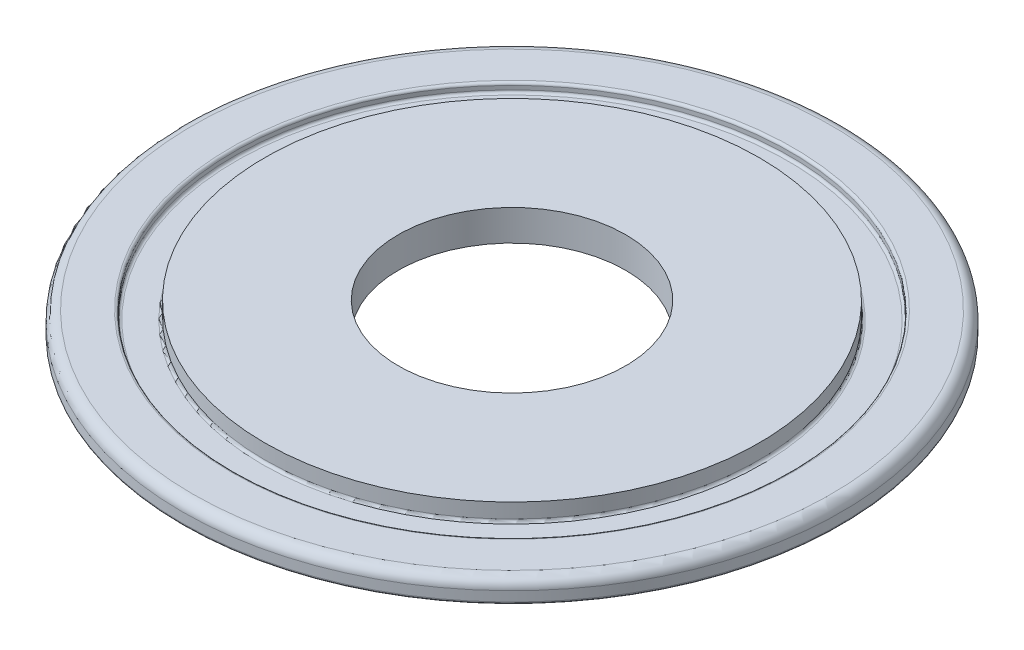
ISO-10303-21;
HEADER;
FILE_DESCRIPTION(('STEP AP214'),'2;1');
FILE_NAME('part.step','',(''),(''),'','','');
FILE_SCHEMA(('AUTOMOTIVE_DESIGN { 1 0 10303 214 1 1 1 1 }'));
ENDSEC;
DATA;
#1=APPLICATION_CONTEXT('core data for automotive mechanical design processes');
#2=APPLICATION_PROTOCOL_DEFINITION('international standard','automotive_design',2000,#1);
#3=PRODUCT_CONTEXT('',#1,'mechanical');
#4=PRODUCT('Part','Part','',(#3));
#5=PRODUCT_RELATED_PRODUCT_CATEGORY('part','',(#4));
#6=PRODUCT_DEFINITION_FORMATION('','',#4);
#7=PRODUCT_DEFINITION_CONTEXT('part definition',#1,'design');
#8=PRODUCT_DEFINITION('design','',#6,#7);
#9=PRODUCT_DEFINITION_SHAPE('','',#8);
#10=(LENGTH_UNIT() NAMED_UNIT(*) SI_UNIT(.MILLI.,.METRE.));
#11=(NAMED_UNIT(*) PLANE_ANGLE_UNIT() SI_UNIT($,.RADIAN.));
#12=(NAMED_UNIT(*) SI_UNIT($,.STERADIAN.) SOLID_ANGLE_UNIT());
#13=UNCERTAINTY_MEASURE_WITH_UNIT(LENGTH_MEASURE(1.E-05),#10,'distance_accuracy_value','');
#14=(GEOMETRIC_REPRESENTATION_CONTEXT(3) GLOBAL_UNCERTAINTY_ASSIGNED_CONTEXT((#13)) GLOBAL_UNIT_ASSIGNED_CONTEXT((#10,
#11,#12)) REPRESENTATION_CONTEXT('',''));
#15=CARTESIAN_POINT('',(0.,0.,0.));
#16=DIRECTION('',(0.,0.,1.));
#17=DIRECTION('',(1.,0.,0.));
#18=AXIS2_PLACEMENT_3D('',#15,#16,#17);
#19=CARTESIAN_POINT('',(50.8,0.,0.));
#20=DIRECTION('',(0.,-1.,0.));
#21=DIRECTION('',(0.,0.,-1.));
#22=AXIS2_PLACEMENT_3D('',#19,#20,#21);
#23=PLANE('',#22);
#24=CARTESIAN_POINT('',(0.,0.,0.));
#25=DIRECTION('',(0.,-1.,0.));
#26=DIRECTION('',(0.,0.,-1.));
#27=AXIS2_PLACEMENT_3D('',#24,#25,#26);
#28=CIRCLE('',#27,50.403125);
#29=CARTESIAN_POINT('',(0.,0.,-50.403125));
#30=VERTEX_POINT('',#29);
#31=EDGE_CURVE('E68',#30,#30,#28,.T.);
#32=ORIENTED_EDGE('',*,*,#31,.T.);
#33=EDGE_LOOP('',(#32));
#34=FACE_BOUND('',#33,.T.);
#35=CARTESIAN_POINT('',(0.,0.,0.));
#36=DIRECTION('',(0.,-1.,0.));
#37=DIRECTION('',(0.,0.,-1.));
#38=AXIS2_PLACEMENT_3D('',#35,#36,#37);
#39=CIRCLE('',#38,17.526);
#40=CARTESIAN_POINT('',(0.,0.,-17.526));
#41=VERTEX_POINT('',#40);
#42=EDGE_CURVE('E71',#41,#41,#39,.T.);
#43=ORIENTED_EDGE('',*,*,#42,.F.);
#44=EDGE_LOOP('',(#43));
#45=FACE_BOUND('',#44,.T.);
#46=ADVANCED_FACE('F33',(#34,#45),#23,.T.);
#47=CARTESIAN_POINT('',(0.,0.,0.));
#48=DIRECTION('',(0.,-1.,0.));
#49=DIRECTION('',(0.,0.,-1.));
#50=AXIS2_PLACEMENT_3D('',#47,#48,#49);
#51=CYLINDRICAL_SURFACE('',#50,17.526);
#52=ORIENTED_EDGE('',*,*,#42,.T.);
#53=EDGE_LOOP('',(#52));
#54=FACE_BOUND('',#53,.T.);
#55=CARTESIAN_POINT('',(0.,4.7625,0.));
#56=DIRECTION('',(0.,-1.,0.));
#57=DIRECTION('',(0.,0.,-1.));
#58=AXIS2_PLACEMENT_3D('',#55,#56,#57);
#59=CIRCLE('',#58,17.526);
#60=CARTESIAN_POINT('',(0.,4.7625,-17.526));
#61=VERTEX_POINT('',#60);
#62=EDGE_CURVE('E74',#61,#61,#59,.T.);
#63=ORIENTED_EDGE('',*,*,#62,.F.);
#64=EDGE_LOOP('',(#63));
#65=FACE_BOUND('',#64,.T.);
#66=ADVANCED_FACE('F85',(#54,#65),#51,.F.);
#67=CARTESIAN_POINT('',(38.1,4.7625,0.));
#68=DIRECTION('',(0.,1.,0.));
#69=DIRECTION('',(0.,0.,1.));
#70=AXIS2_PLACEMENT_3D('',#67,#68,#69);
#71=PLANE('',#70);
#72=ORIENTED_EDGE('',*,*,#62,.T.);
#73=EDGE_LOOP('',(#72));
#74=FACE_BOUND('',#73,.T.);
#75=CARTESIAN_POINT('',(0.,4.7625,0.));
#76=DIRECTION('',(0.,-1.,0.));
#77=DIRECTION('',(0.,0.,-1.));
#78=AXIS2_PLACEMENT_3D('',#75,#76,#77);
#79=CIRCLE('',#78,38.1);
#80=CARTESIAN_POINT('',(0.,4.7625,-38.1));
#81=VERTEX_POINT('',#80);
#82=EDGE_CURVE('E77',#81,#81,#79,.T.);
#83=ORIENTED_EDGE('',*,*,#82,.F.);
#84=EDGE_LOOP('',(#83));
#85=FACE_BOUND('',#84,.T.);
#86=ADVANCED_FACE('F83',(#74,#85),#71,.T.);
#87=CARTESIAN_POINT('',(0.,0.,0.));
#88=DIRECTION('',(0.,-1.,0.));
#89=DIRECTION('',(0.,0.,-1.));
#90=AXIS2_PLACEMENT_3D('',#87,#88,#89);
#91=CYLINDRICAL_SURFACE('',#90,38.1);
#92=CARTESIAN_POINT('',(0.,2.492375,0.));
#93=DIRECTION('',(0.,1.,0.));
#94=DIRECTION('',(0.,0.,1.));
#95=AXIS2_PLACEMENT_3D('',#92,#93,#94);
#96=CIRCLE('',#95,38.1);
#97=CARTESIAN_POINT('',(0.,2.492375,38.1));
#98=VERTEX_POINT('',#97);
#99=EDGE_CURVE('E44',#98,#98,#96,.T.);
#100=ORIENTED_EDGE('',*,*,#99,.T.);
#101=EDGE_LOOP('',(#100));
#102=FACE_BOUND('',#101,.T.);
#103=ORIENTED_EDGE('',*,*,#82,.T.);
#104=EDGE_LOOP('',(#103));
#105=FACE_BOUND('',#104,.T.);
#106=ADVANCED_FACE('F81',(#102,#105),#91,.T.);
#107=CARTESIAN_POINT('',(42.926,2.0955,0.));
#108=DIRECTION('',(0.,1.,0.));
#109=DIRECTION('',(0.,0.,1.));
#110=AXIS2_PLACEMENT_3D('',#107,#108,#109);
#111=PLANE('',#110);
#112=CARTESIAN_POINT('',(0.,2.0955,0.));
#113=DIRECTION('',(0.,1.,0.));
#114=DIRECTION('',(0.,0.,1.));
#115=AXIS2_PLACEMENT_3D('',#112,#113,#114);
#116=CIRCLE('',#115,38.496875);
#117=CARTESIAN_POINT('',(0.,2.0955,38.496875));
#118=VERTEX_POINT('',#117);
#119=EDGE_CURVE('E48',#118,#118,#116,.F.);
#120=ORIENTED_EDGE('',*,*,#119,.T.);
#121=EDGE_LOOP('',(#120));
#122=FACE_BOUND('',#121,.T.);
#123=CARTESIAN_POINT('',(0.,2.0955,0.));
#124=DIRECTION('',(0.,1.,0.));
#125=DIRECTION('',(0.,0.,1.));
#126=AXIS2_PLACEMENT_3D('',#123,#124,#125);
#127=CIRCLE('',#126,42.529125);
#128=CARTESIAN_POINT('',(0.,2.0955,42.529125));
#129=VERTEX_POINT('',#128);
#130=EDGE_CURVE('E53',#129,#129,#127,.T.);
#131=ORIENTED_EDGE('',*,*,#130,.T.);
#132=EDGE_LOOP('',(#131));
#133=FACE_BOUND('',#132,.T.);
#134=ADVANCED_FACE('F92',(#122,#133),#111,.T.);
#135=CARTESIAN_POINT('',(0.,0.,0.));
#136=DIRECTION('',(0.,-1.,0.));
#137=DIRECTION('',(0.,0.,-1.));
#138=AXIS2_PLACEMENT_3D('',#135,#136,#137);
#139=CYLINDRICAL_SURFACE('',#138,42.926);
#140=CARTESIAN_POINT('',(0.,3.095625,0.));
#141=DIRECTION('',(0.,1.,0.));
#142=DIRECTION('',(0.,0.,1.));
#143=AXIS2_PLACEMENT_3D('',#140,#141,#142);
#144=CIRCLE('',#143,42.926);
#145=CARTESIAN_POINT('',(0.,3.095625,42.926));
#146=VERTEX_POINT('',#145);
#147=EDGE_CURVE('E56',#146,#146,#144,.T.);
#148=ORIENTED_EDGE('',*,*,#147,.T.);
#149=EDGE_LOOP('',(#148));
#150=FACE_BOUND('',#149,.T.);
#151=CARTESIAN_POINT('',(0.,2.492375,0.));
#152=DIRECTION('',(0.,1.,0.));
#153=DIRECTION('',(0.,0.,1.));
#154=AXIS2_PLACEMENT_3D('',#151,#152,#153);
#155=CIRCLE('',#154,42.926);
#156=CARTESIAN_POINT('',(0.,2.492375,42.926));
#157=VERTEX_POINT('',#156);
#158=EDGE_CURVE('E59',#157,#157,#155,.F.);
#159=ORIENTED_EDGE('',*,*,#158,.T.);
#160=EDGE_LOOP('',(#159));
#161=FACE_BOUND('',#160,.T.);
#162=ADVANCED_FACE('F127',(#150,#161),#139,.F.);
#163=CARTESIAN_POINT('',(50.8,3.4925,0.));
#164=DIRECTION('',(0.,1.,0.));
#165=DIRECTION('',(0.,0.,1.));
#166=AXIS2_PLACEMENT_3D('',#163,#164,#165);
#167=PLANE('',#166);
#168=CARTESIAN_POINT('',(0.,3.4925,0.));
#169=DIRECTION('',(0.,1.,0.));
#170=DIRECTION('',(0.,0.,1.));
#171=AXIS2_PLACEMENT_3D('',#168,#169,#170);
#172=CIRCLE('',#171,49.2125);
#173=CARTESIAN_POINT('',(0.,3.4925,49.2125));
#174=VERTEX_POINT('',#173);
#175=EDGE_CURVE('E10',#174,#174,#172,.T.);
#176=ORIENTED_EDGE('',*,*,#175,.T.);
#177=EDGE_LOOP('',(#176));
#178=FACE_BOUND('',#177,.T.);
#179=CARTESIAN_POINT('',(0.,3.4925,0.));
#180=DIRECTION('',(0.,1.,0.));
#181=DIRECTION('',(0.,0.,1.));
#182=AXIS2_PLACEMENT_3D('',#179,#180,#181);
#183=CIRCLE('',#182,43.322875);
#184=CARTESIAN_POINT('',(0.,3.4925,43.322875));
#185=VERTEX_POINT('',#184);
#186=EDGE_CURVE('E62',#185,#185,#183,.F.);
#187=ORIENTED_EDGE('',*,*,#186,.T.);
#188=EDGE_LOOP('',(#187));
#189=FACE_BOUND('',#188,.T.);
#190=ADVANCED_FACE('F129',(#178,#189),#167,.T.);
#191=CARTESIAN_POINT('',(0.,0.,0.));
#192=DIRECTION('',(0.,-1.,0.));
#193=DIRECTION('',(0.,0.,-1.));
#194=AXIS2_PLACEMENT_3D('',#191,#192,#193);
#195=CYLINDRICAL_SURFACE('',#194,50.8);
#196=CARTESIAN_POINT('',(0.,1.905,0.));
#197=DIRECTION('',(0.,1.,0.));
#198=DIRECTION('',(0.,0.,1.));
#199=AXIS2_PLACEMENT_3D('',#196,#197,#198);
#200=CIRCLE('',#199,50.8);
#201=CARTESIAN_POINT('',(0.,1.905,50.8));
#202=VERTEX_POINT('',#201);
#203=EDGE_CURVE('E40',#202,#202,#200,.F.);
#204=ORIENTED_EDGE('',*,*,#203,.T.);
#205=EDGE_LOOP('',(#204));
#206=FACE_BOUND('',#205,.T.);
#207=CARTESIAN_POINT('',(0.,0.396874999999999,0.));
#208=DIRECTION('',(0.,-1.,0.));
#209=DIRECTION('',(0.,0.,-1.));
#210=AXIS2_PLACEMENT_3D('',#207,#208,#209);
#211=CIRCLE('',#210,50.8);
#212=CARTESIAN_POINT('',(0.,0.396874999999999,-50.8));
#213=VERTEX_POINT('',#212);
#214=EDGE_CURVE('E65',#213,#213,#211,.F.);
#215=ORIENTED_EDGE('',*,*,#214,.T.);
#216=EDGE_LOOP('',(#215));
#217=FACE_BOUND('',#216,.T.);
#218=ADVANCED_FACE('F108',(#206,#217),#195,.T.);
#219=CARTESIAN_POINT('',(0.,0.396874999999999,0.));
#220=DIRECTION('',(0.,-1.,0.));
#221=DIRECTION('',(0.,0.,-1.));
#222=AXIS2_PLACEMENT_3D('',#219,#220,#221);
#223=TOROIDAL_SURFACE('',#222,50.403125,0.396875);
#224=ORIENTED_EDGE('',*,*,#214,.F.);
#225=EDGE_LOOP('',(#224));
#226=FACE_BOUND('',#225,.T.);
#227=ORIENTED_EDGE('',*,*,#31,.F.);
#228=EDGE_LOOP('',(#227));
#229=FACE_BOUND('',#228,.T.);
#230=ADVANCED_FACE('F104',(#226,#229),#223,.T.);
#231=CARTESIAN_POINT('',(0.,3.095625,0.));
#232=DIRECTION('',(0.,1.,0.));
#233=DIRECTION('',(0.,0.,1.));
#234=AXIS2_PLACEMENT_3D('',#231,#232,#233);
#235=TOROIDAL_SURFACE('',#234,43.322875,0.396875);
#236=ORIENTED_EDGE('',*,*,#147,.F.);
#237=EDGE_LOOP('',(#236));
#238=FACE_BOUND('',#237,.T.);
#239=ORIENTED_EDGE('',*,*,#186,.F.);
#240=EDGE_LOOP('',(#239));
#241=FACE_BOUND('',#240,.T.);
#242=ADVANCED_FACE('F107',(#238,#241),#235,.T.);
#243=CARTESIAN_POINT('',(0.,2.492375,0.));
#244=DIRECTION('',(0.,1.,0.));
#245=DIRECTION('',(0.,0.,1.));
#246=AXIS2_PLACEMENT_3D('',#243,#244,#245);
#247=TOROIDAL_SURFACE('',#246,38.496875,0.396875);
#248=ORIENTED_EDGE('',*,*,#99,.F.);
#249=EDGE_LOOP('',(#248));
#250=FACE_BOUND('',#249,.T.);
#251=ORIENTED_EDGE('',*,*,#119,.F.);
#252=EDGE_LOOP('',(#251));
#253=FACE_BOUND('',#252,.T.);
#254=ADVANCED_FACE('F112',(#250,#253),#247,.F.);
#255=CARTESIAN_POINT('',(0.,2.492375,0.));
#256=DIRECTION('',(0.,1.,0.));
#257=DIRECTION('',(0.,0.,1.));
#258=AXIS2_PLACEMENT_3D('',#255,#256,#257);
#259=TOROIDAL_SURFACE('',#258,42.529125,0.396875);
#260=ORIENTED_EDGE('',*,*,#130,.F.);
#261=EDGE_LOOP('',(#260));
#262=FACE_BOUND('',#261,.T.);
#263=ORIENTED_EDGE('',*,*,#158,.F.);
#264=EDGE_LOOP('',(#263));
#265=FACE_BOUND('',#264,.T.);
#266=ADVANCED_FACE('F115',(#262,#265),#259,.F.);
#267=CARTESIAN_POINT('',(0.,1.905,0.));
#268=DIRECTION('',(0.,1.,0.));
#269=DIRECTION('',(0.,0.,1.));
#270=AXIS2_PLACEMENT_3D('',#267,#268,#269);
#271=TOROIDAL_SURFACE('',#270,49.2125,1.5875);
#272=ORIENTED_EDGE('',*,*,#175,.F.);
#273=EDGE_LOOP('',(#272));
#274=FACE_BOUND('',#273,.T.);
#275=ORIENTED_EDGE('',*,*,#203,.F.);
#276=EDGE_LOOP('',(#275));
#277=FACE_BOUND('',#276,.T.);
#278=ADVANCED_FACE('F35',(#274,#277),#271,.T.);
#279=CLOSED_SHELL('',(#46,#66,#86,#106,#134,#162,#190,#218,#230,#242,#254,#266,#278));
#280=MANIFOLD_SOLID_BREP('B2',#279);
#281=ADVANCED_BREP_SHAPE_REPRESENTATION('',(#18,#280),#14);
#282=SHAPE_DEFINITION_REPRESENTATION(#9,#281);
ENDSEC;
END-ISO-10303-21;
